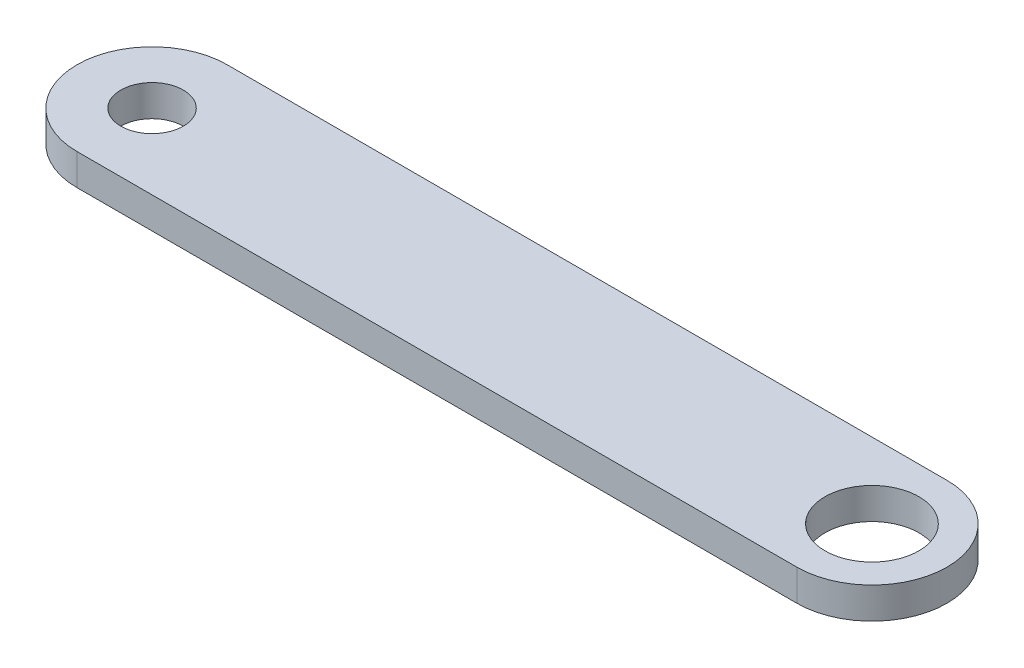
ISO-10303-21;
HEADER;
FILE_DESCRIPTION(('STEP AP214'),'2;1');
FILE_NAME('part.step','',(''),(''),'','','');
FILE_SCHEMA(('AUTOMOTIVE_DESIGN { 1 0 10303 214 1 1 1 1 }'));
ENDSEC;
DATA;
#1=APPLICATION_CONTEXT('core data for automotive mechanical design processes');
#2=APPLICATION_PROTOCOL_DEFINITION('international standard','automotive_design',2000,#1);
#3=PRODUCT_CONTEXT('',#1,'mechanical');
#4=PRODUCT('Part','Part','',(#3));
#5=PRODUCT_RELATED_PRODUCT_CATEGORY('part','',(#4));
#6=PRODUCT_DEFINITION_FORMATION('','',#4);
#7=PRODUCT_DEFINITION_CONTEXT('part definition',#1,'design');
#8=PRODUCT_DEFINITION('design','',#6,#7);
#9=PRODUCT_DEFINITION_SHAPE('','',#8);
#10=(LENGTH_UNIT() NAMED_UNIT(*) SI_UNIT(.MILLI.,.METRE.));
#11=(NAMED_UNIT(*) PLANE_ANGLE_UNIT() SI_UNIT($,.RADIAN.));
#12=(NAMED_UNIT(*) SI_UNIT($,.STERADIAN.) SOLID_ANGLE_UNIT());
#13=UNCERTAINTY_MEASURE_WITH_UNIT(LENGTH_MEASURE(1.E-05),#10,'distance_accuracy_value','');
#14=(GEOMETRIC_REPRESENTATION_CONTEXT(3) GLOBAL_UNCERTAINTY_ASSIGNED_CONTEXT((#13)) GLOBAL_UNIT_ASSIGNED_CONTEXT((#10,
#11,#12)) REPRESENTATION_CONTEXT('',''));
#15=CARTESIAN_POINT('',(0.,0.,0.));
#16=DIRECTION('',(0.,0.,1.));
#17=DIRECTION('',(1.,0.,0.));
#18=AXIS2_PLACEMENT_3D('',#15,#16,#17);
#19=CARTESIAN_POINT('',(-13.0494036010891,3.001,0.));
#20=DIRECTION('',(0.,1.,0.));
#21=DIRECTION('',(0.,0.,1.));
#22=AXIS2_PLACEMENT_3D('',#19,#20,#21);
#23=PLANE('',#22);
#24=CARTESIAN_POINT('',(-13.0494036010891,3.001,0.));
#25=DIRECTION('',(0.,1.,0.));
#26=DIRECTION('',(0.,0.,1.));
#27=AXIS2_PLACEMENT_3D('',#24,#25,#26);
#28=CIRCLE('',#27,1.002);
#29=CARTESIAN_POINT('',(-13.0494036010891,3.001,1.00199999999999));
#30=VERTEX_POINT('',#29);
#31=EDGE_CURVE('E123',#30,#30,#28,.T.);
#32=ORIENTED_EDGE('',*,*,#31,.F.);
#33=EDGE_LOOP('',(#32));
#34=FACE_BOUND('',#33,.T.);
#35=CARTESIAN_POINT('',(-13.0494036010891,3.001,0.));
#36=DIRECTION('',(0.,1.,0.));
#37=DIRECTION('',(0.,0.,1.));
#38=AXIS2_PLACEMENT_3D('',#35,#36,#37);
#39=CIRCLE('',#38,2.4048);
#40=CARTESIAN_POINT('',(-13.0494036010891,3.001,-2.40480000000001));
#41=VERTEX_POINT('',#40);
#42=CARTESIAN_POINT('',(-13.0494036010891,3.001,2.40479999999999));
#43=VERTEX_POINT('',#42);
#44=EDGE_CURVE('E100',#41,#43,#39,.T.);
#45=ORIENTED_EDGE('',*,*,#44,.T.);
#46=DIRECTION('',(1.,0.,0.));
#47=VECTOR('',#46,1.);
#48=CARTESIAN_POINT('',(-13.0494036010891,3.001,2.40479999999999));
#49=LINE('',#48,#47);
#50=CARTESIAN_POINT('',(9.99659639891087,3.001,2.40479999999999));
#51=VERTEX_POINT('',#50);
#52=EDGE_CURVE('E95',#43,#51,#49,.T.);
#53=ORIENTED_EDGE('',*,*,#52,.T.);
#54=CARTESIAN_POINT('',(9.99659639891087,3.001,0.));
#55=DIRECTION('',(0.,1.,0.));
#56=DIRECTION('',(0.,0.,1.));
#57=AXIS2_PLACEMENT_3D('',#54,#55,#56);
#58=CIRCLE('',#57,2.4048);
#59=CARTESIAN_POINT('',(9.99659639891087,3.001,-2.40480000000001));
#60=VERTEX_POINT('',#59);
#61=EDGE_CURVE('E98',#51,#60,#58,.T.);
#62=ORIENTED_EDGE('',*,*,#61,.T.);
#63=DIRECTION('',(-1.,0.,0.));
#64=VECTOR('',#63,1.);
#65=CARTESIAN_POINT('',(-13.0494036010891,3.001,-2.40480000000001));
#66=LINE('',#65,#64);
#67=EDGE_CURVE('E65',#60,#41,#66,.T.);
#68=ORIENTED_EDGE('',*,*,#67,.T.);
#69=EDGE_LOOP('',(#45,#53,#62,#68));
#70=FACE_BOUND('',#69,.T.);
#71=CARTESIAN_POINT('',(9.99659639891087,3.001,0.));
#72=DIRECTION('',(0.,1.,0.));
#73=DIRECTION('',(0.,0.,1.));
#74=AXIS2_PLACEMENT_3D('',#71,#72,#73);
#75=CIRCLE('',#74,1.503);
#76=CARTESIAN_POINT('',(9.99659639891087,3.001,1.50299999999999));
#77=VERTEX_POINT('',#76);
#78=EDGE_CURVE('E147',#77,#77,#75,.T.);
#79=ORIENTED_EDGE('',*,*,#78,.F.);
#80=EDGE_LOOP('',(#79));
#81=FACE_BOUND('',#80,.T.);
#82=ADVANCED_FACE('F47',(#34,#70,#81),#23,.T.);
#83=CARTESIAN_POINT('',(-13.0494036010891,1.999,0.));
#84=DIRECTION('',(0.,1.,0.));
#85=DIRECTION('',(0.,0.,1.));
#86=AXIS2_PLACEMENT_3D('',#83,#84,#85);
#87=PLANE('',#86);
#88=CARTESIAN_POINT('',(-13.0494036010891,1.999,0.));
#89=DIRECTION('',(0.,1.,0.));
#90=DIRECTION('',(0.,0.,1.));
#91=AXIS2_PLACEMENT_3D('',#88,#89,#90);
#92=CIRCLE('',#91,2.4048);
#93=CARTESIAN_POINT('',(-13.0494036010891,1.999,-2.40480000000001));
#94=VERTEX_POINT('',#93);
#95=CARTESIAN_POINT('',(-13.0494036010891,1.999,2.40479999999999));
#96=VERTEX_POINT('',#95);
#97=EDGE_CURVE('E119',#94,#96,#92,.T.);
#98=ORIENTED_EDGE('',*,*,#97,.F.);
#99=DIRECTION('',(-1.,0.,0.));
#100=VECTOR('',#99,1.);
#101=CARTESIAN_POINT('',(-13.0494036010891,1.999,-2.40480000000001));
#102=LINE('',#101,#100);
#103=CARTESIAN_POINT('',(9.99659639891087,1.999,-2.40480000000001));
#104=VERTEX_POINT('',#103);
#105=EDGE_CURVE('E88',#104,#94,#102,.T.);
#106=ORIENTED_EDGE('',*,*,#105,.F.);
#107=CARTESIAN_POINT('',(9.99659639891087,1.999,0.));
#108=DIRECTION('',(0.,1.,0.));
#109=DIRECTION('',(0.,0.,1.));
#110=AXIS2_PLACEMENT_3D('',#107,#108,#109);
#111=CIRCLE('',#110,2.4048);
#112=CARTESIAN_POINT('',(9.99659639891087,1.999,2.40479999999999));
#113=VERTEX_POINT('',#112);
#114=EDGE_CURVE('E82',#113,#104,#111,.T.);
#115=ORIENTED_EDGE('',*,*,#114,.F.);
#116=DIRECTION('',(1.,0.,0.));
#117=VECTOR('',#116,1.);
#118=CARTESIAN_POINT('',(-13.0494036010891,1.999,2.40479999999999));
#119=LINE('',#118,#117);
#120=EDGE_CURVE('E105',#96,#113,#119,.T.);
#121=ORIENTED_EDGE('',*,*,#120,.F.);
#122=EDGE_LOOP('',(#98,#106,#115,#121));
#123=FACE_BOUND('',#122,.T.);
#124=CARTESIAN_POINT('',(-13.0494036010891,1.999,0.));
#125=DIRECTION('',(0.,1.,0.));
#126=DIRECTION('',(0.,0.,1.));
#127=AXIS2_PLACEMENT_3D('',#124,#125,#126);
#128=CIRCLE('',#127,1.002);
#129=CARTESIAN_POINT('',(-13.0494036010891,1.999,1.00199999999999));
#130=VERTEX_POINT('',#129);
#131=EDGE_CURVE('E144',#130,#130,#128,.T.);
#132=ORIENTED_EDGE('',*,*,#131,.T.);
#133=EDGE_LOOP('',(#132));
#134=FACE_BOUND('',#133,.T.);
#135=CARTESIAN_POINT('',(9.99659639891087,1.999,0.));
#136=DIRECTION('',(0.,1.,0.));
#137=DIRECTION('',(0.,0.,1.));
#138=AXIS2_PLACEMENT_3D('',#135,#136,#137);
#139=CIRCLE('',#138,1.503);
#140=CARTESIAN_POINT('',(9.99659639891087,1.999,1.50299999999999));
#141=VERTEX_POINT('',#140);
#142=EDGE_CURVE('E151',#141,#141,#139,.T.);
#143=ORIENTED_EDGE('',*,*,#142,.T.);
#144=EDGE_LOOP('',(#143));
#145=FACE_BOUND('',#144,.T.);
#146=ADVANCED_FACE('F137',(#123,#134,#145),#87,.F.);
#147=CARTESIAN_POINT('',(-13.0494036010891,3.001,0.));
#148=DIRECTION('',(0.,-1.,0.));
#149=DIRECTION('',(0.,0.,-1.));
#150=AXIS2_PLACEMENT_3D('',#147,#148,#149);
#151=CYLINDRICAL_SURFACE('',#150,2.4048);
#152=ORIENTED_EDGE('',*,*,#97,.T.);
#153=DIRECTION('',(0.,-1.,0.));
#154=VECTOR('',#153,1.);
#155=CARTESIAN_POINT('',(-13.0494036010891,3.001,2.40479999999999));
#156=LINE('',#155,#154);
#157=EDGE_CURVE('E11',#43,#96,#156,.T.);
#158=ORIENTED_EDGE('',*,*,#157,.F.);
#159=ORIENTED_EDGE('',*,*,#44,.F.);
#160=DIRECTION('',(0.,-1.,0.));
#161=VECTOR('',#160,1.);
#162=CARTESIAN_POINT('',(-13.0494036010891,3.001,-2.40480000000001));
#163=LINE('',#162,#161);
#164=EDGE_CURVE('E115',#41,#94,#163,.T.);
#165=ORIENTED_EDGE('',*,*,#164,.T.);
#166=EDGE_LOOP('',(#152,#158,#159,#165));
#167=FACE_BOUND('',#166,.T.);
#168=ADVANCED_FACE('F49',(#167),#151,.T.);
#169=CARTESIAN_POINT('',(-13.0494036010891,3.001,2.40479999999999));
#170=DIRECTION('',(0.,0.,-1.));
#171=DIRECTION('',(-1.,0.,0.));
#172=AXIS2_PLACEMENT_3D('',#169,#170,#171);
#173=PLANE('',#172);
#174=ORIENTED_EDGE('',*,*,#120,.T.);
#175=DIRECTION('',(0.,-1.,0.));
#176=VECTOR('',#175,1.);
#177=CARTESIAN_POINT('',(9.99659639891087,3.001,2.40479999999999));
#178=LINE('',#177,#176);
#179=EDGE_CURVE('E57',#51,#113,#178,.T.);
#180=ORIENTED_EDGE('',*,*,#179,.F.);
#181=ORIENTED_EDGE('',*,*,#52,.F.);
#182=ORIENTED_EDGE('',*,*,#157,.T.);
#183=EDGE_LOOP('',(#174,#180,#181,#182));
#184=FACE_BOUND('',#183,.T.);
#185=ADVANCED_FACE('F104',(#184),#173,.F.);
#186=CARTESIAN_POINT('',(9.99659639891087,3.001,0.));
#187=DIRECTION('',(0.,-1.,0.));
#188=DIRECTION('',(0.,0.,-1.));
#189=AXIS2_PLACEMENT_3D('',#186,#187,#188);
#190=CYLINDRICAL_SURFACE('',#189,2.4048);
#191=ORIENTED_EDGE('',*,*,#114,.T.);
#192=DIRECTION('',(0.,-1.,0.));
#193=VECTOR('',#192,1.);
#194=CARTESIAN_POINT('',(9.99659639891087,3.001,-2.40480000000001));
#195=LINE('',#194,#193);
#196=EDGE_CURVE('E107',#60,#104,#195,.T.);
#197=ORIENTED_EDGE('',*,*,#196,.F.);
#198=ORIENTED_EDGE('',*,*,#61,.F.);
#199=ORIENTED_EDGE('',*,*,#179,.T.);
#200=EDGE_LOOP('',(#191,#197,#198,#199));
#201=FACE_BOUND('',#200,.T.);
#202=ADVANCED_FACE('F108',(#201),#190,.T.);
#203=CARTESIAN_POINT('',(-13.0494036010891,3.001,-2.40480000000001));
#204=DIRECTION('',(0.,0.,1.));
#205=DIRECTION('',(1.,0.,0.));
#206=AXIS2_PLACEMENT_3D('',#203,#204,#205);
#207=PLANE('',#206);
#208=ORIENTED_EDGE('',*,*,#105,.T.);
#209=ORIENTED_EDGE('',*,*,#164,.F.);
#210=ORIENTED_EDGE('',*,*,#67,.F.);
#211=ORIENTED_EDGE('',*,*,#196,.T.);
#212=EDGE_LOOP('',(#208,#209,#210,#211));
#213=FACE_BOUND('',#212,.T.);
#214=ADVANCED_FACE('F134',(#213),#207,.F.);
#215=CARTESIAN_POINT('',(-13.0494036010891,3.001,0.));
#216=DIRECTION('',(0.,-1.,0.));
#217=DIRECTION('',(0.,0.,-1.));
#218=AXIS2_PLACEMENT_3D('',#215,#216,#217);
#219=CYLINDRICAL_SURFACE('',#218,1.002);
#220=ORIENTED_EDGE('',*,*,#31,.T.);
#221=EDGE_LOOP('',(#220));
#222=FACE_BOUND('',#221,.T.);
#223=ORIENTED_EDGE('',*,*,#131,.F.);
#224=EDGE_LOOP('',(#223));
#225=FACE_BOUND('',#224,.T.);
#226=ADVANCED_FACE('F169',(#222,#225),#219,.F.);
#227=CARTESIAN_POINT('',(9.99659639891087,3.001,0.));
#228=DIRECTION('',(0.,-1.,0.));
#229=DIRECTION('',(0.,0.,-1.));
#230=AXIS2_PLACEMENT_3D('',#227,#228,#229);
#231=CYLINDRICAL_SURFACE('',#230,1.503);
#232=ORIENTED_EDGE('',*,*,#78,.T.);
#233=EDGE_LOOP('',(#232));
#234=FACE_BOUND('',#233,.T.);
#235=ORIENTED_EDGE('',*,*,#142,.F.);
#236=EDGE_LOOP('',(#235));
#237=FACE_BOUND('',#236,.T.);
#238=ADVANCED_FACE('F158',(#234,#237),#231,.F.);
#239=CLOSED_SHELL('',(#82,#146,#168,#185,#202,#214,#226,#238));
#240=MANIFOLD_SOLID_BREP('B2',#239);
#241=ADVANCED_BREP_SHAPE_REPRESENTATION('',(#18,#240),#14);
#242=SHAPE_DEFINITION_REPRESENTATION(#9,#241);
ENDSEC;
END-ISO-10303-21;
